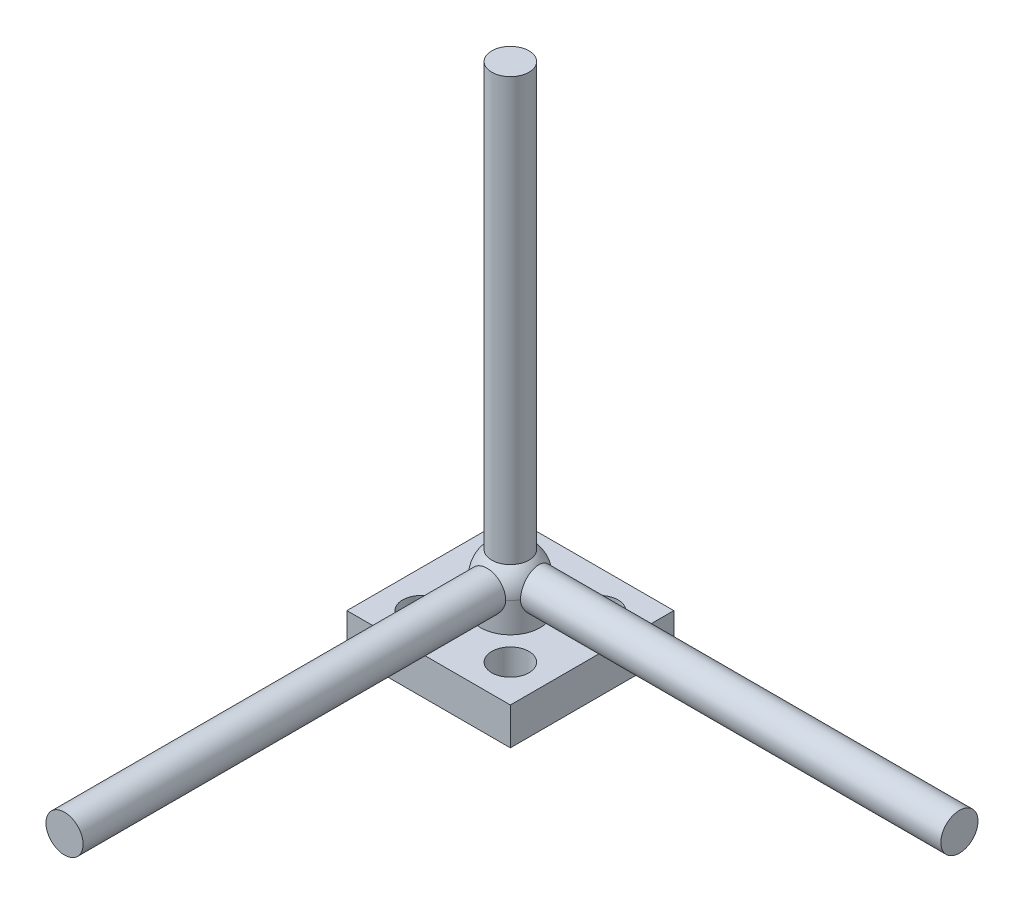
ISO-10303-21;
HEADER;
FILE_DESCRIPTION(('STEP AP214'),'2;1');
FILE_NAME('part.step','',(''),(''),'','','');
FILE_SCHEMA(('AUTOMOTIVE_DESIGN { 1 0 10303 214 1 1 1 1 }'));
ENDSEC;
DATA;
#1=APPLICATION_CONTEXT('core data for automotive mechanical design processes');
#2=APPLICATION_PROTOCOL_DEFINITION('international standard','automotive_design',2000,#1);
#3=PRODUCT_CONTEXT('',#1,'mechanical');
#4=PRODUCT('Part','Part','',(#3));
#5=PRODUCT_RELATED_PRODUCT_CATEGORY('part','',(#4));
#6=PRODUCT_DEFINITION_FORMATION('','',#4);
#7=PRODUCT_DEFINITION_CONTEXT('part definition',#1,'design');
#8=PRODUCT_DEFINITION('design','',#6,#7);
#9=PRODUCT_DEFINITION_SHAPE('','',#8);
#10=(LENGTH_UNIT() NAMED_UNIT(*) SI_UNIT(.MILLI.,.METRE.));
#11=(NAMED_UNIT(*) PLANE_ANGLE_UNIT() SI_UNIT($,.RADIAN.));
#12=(NAMED_UNIT(*) SI_UNIT($,.STERADIAN.) SOLID_ANGLE_UNIT());
#13=UNCERTAINTY_MEASURE_WITH_UNIT(LENGTH_MEASURE(1.E-05),#10,'distance_accuracy_value','');
#14=(GEOMETRIC_REPRESENTATION_CONTEXT(3) GLOBAL_UNCERTAINTY_ASSIGNED_CONTEXT((#13)) GLOBAL_UNIT_ASSIGNED_CONTEXT((#10,
#11,#12)) REPRESENTATION_CONTEXT('',''));
#15=CARTESIAN_POINT('',(0.,0.,0.));
#16=DIRECTION('',(0.,0.,1.));
#17=DIRECTION('',(1.,0.,0.));
#18=AXIS2_PLACEMENT_3D('',#15,#16,#17);
#19=CARTESIAN_POINT('',(0.,9.,0.));
#20=DIRECTION('',(0.,-1.,0.));
#21=DIRECTION('',(0.,0.,-1.));
#22=AXIS2_PLACEMENT_3D('',#19,#20,#21);
#23=CYLINDRICAL_SURFACE('',#22,4.);
#24=CARTESIAN_POINT('',(0.,5.,0.));
#25=DIRECTION('',(0.,-1.,0.));
#26=DIRECTION('',(0.,0.,-1.));
#27=AXIS2_PLACEMENT_3D('',#24,#25,#26);
#28=CIRCLE('',#27,4.);
#29=CARTESIAN_POINT('',(0.,5.,-4.));
#30=VERTEX_POINT('',#29);
#31=EDGE_CURVE('E108',#30,#30,#28,.T.);
#32=ORIENTED_EDGE('',*,*,#31,.F.);
#33=EDGE_LOOP('',(#32));
#34=FACE_BOUND('',#33,.T.);
#35=CARTESIAN_POINT('',(0.,9.,0.));
#36=DIRECTION('',(0.,-1.,0.));
#37=DIRECTION('',(0.,0.,-1.));
#38=AXIS2_PLACEMENT_3D('',#35,#36,#37);
#39=CIRCLE('',#38,4.);
#40=CARTESIAN_POINT('',(-2.5,9.,3.1224989991992));
#41=VERTEX_POINT('',#40);
#42=CARTESIAN_POINT('',(2.713622209593,9.,-2.9387505004004));
#43=VERTEX_POINT('',#42);
#44=EDGE_CURVE('E100',#41,#43,#39,.T.);
#45=ORIENTED_EDGE('',*,*,#44,.T.);
#46=CARTESIAN_POINT('',(3.42800969957793,9.,2.0612494995996));
#47=CARTESIAN_POINT('',(3.42802038790868,9.13026135972633,2.0612419052499));
#48=CARTESIAN_POINT('',(3.43424101726913,9.26074277237895,2.05099325827633));
#49=CARTESIAN_POINT('',(3.4580690540885,9.51767210537658,2.01054114311706));
#50=CARTESIAN_POINT('',(3.47570727586293,9.64410813592399,1.98028366942228));
#51=CARTESIAN_POINT('',(3.51942581384705,9.88865756454744,1.9014831189024));
#52=CARTESIAN_POINT('',(3.54545409925808,10.0068169301907,1.85305244661234));
#53=CARTESIAN_POINT('',(3.60252255102449,10.2334121318975,1.73949954429685));
#54=CARTESIAN_POINT('',(3.63356262760076,10.341848142087,1.67437761325933));
#55=CARTESIAN_POINT('',(3.7000822413658,10.5568638804176,1.52213679037703));
#56=CARTESIAN_POINT('',(3.7357077613753,10.6623597747365,1.43354755523072));
#57=CARTESIAN_POINT('',(3.80442537038909,10.857867335649,1.23972616144308));
#58=CARTESIAN_POINT('',(3.8375162620606,10.9478717089369,1.13448620825776));
#59=CARTESIAN_POINT('',(3.89836345764576,11.1136504181868,0.904187484131161));
#60=CARTESIAN_POINT('',(3.92581437911848,11.1886066647498,0.778452078282578));
#61=CARTESIAN_POINT('',(3.96906285977782,11.3158906334044,0.51418613997217));
#62=CARTESIAN_POINT('',(3.98487380149797,11.368244313019,0.375670507914283));
#63=CARTESIAN_POINT('',(4.00059864656233,11.4433662779335,0.106485647628052));
#64=CARTESIAN_POINT('',(4.00207678680657,11.4687654704651,-0.0233580679752801));
#65=CARTESIAN_POINT('',(3.99198197601377,11.4987253721379,-0.28490242778374));
#66=CARTESIAN_POINT('',(3.98041548664065,11.5032963928738,-0.416602120730132));
#67=CARTESIAN_POINT('',(3.94602158489037,11.4925134538478,-0.665858084556408));
#68=CARTESIAN_POINT('',(3.92426603966481,11.4788650251918,-0.783644929784783));
#69=CARTESIAN_POINT('',(3.87114490652014,11.4357371177857,-1.01401137328338));
#70=CARTESIAN_POINT('',(3.83977698364927,11.4062537912545,-1.12658969869116));
#71=CARTESIAN_POINT('',(3.76712452162126,11.3310373645404,-1.35032176175276));
#72=CARTESIAN_POINT('',(3.72538830525859,11.2844973970169,-1.46105413343702));
#73=CARTESIAN_POINT('',(3.63532879753264,11.1775349964946,-1.67260885737574));
#74=CARTESIAN_POINT('',(3.58700449027072,11.1171104214707,-1.77342967711149));
#75=CARTESIAN_POINT('',(3.47802529720666,10.9732887266442,-1.97965637058244));
#76=CARTESIAN_POINT('',(3.41663820821204,10.8877588528214,-2.08318356561219));
#77=CARTESIAN_POINT('',(3.29198691872054,10.7017232736575,-2.27506710612456));
#78=CARTESIAN_POINT('',(3.2287183331008,10.6011799578739,-2.36338411626043));
#79=CARTESIAN_POINT('',(3.13136142504637,10.4318040890128,-2.48957441367807));
#80=CARTESIAN_POINT('',(3.09627403897767,10.3675996854581,-2.53295936516354));
#81=CARTESIAN_POINT('',(3.02816693266716,10.2346490870281,-2.61400311710698));
#82=CARTESIAN_POINT('',(2.99514797315186,10.1659012400453,-2.65165981801561));
#83=CARTESIAN_POINT('',(2.90130959507655,9.95333768340782,-2.75517600604384));
#84=CARTESIAN_POINT('',(2.8452970661671,9.80253169999326,-2.81208906235644));
#85=CARTESIAN_POINT('',(2.77680711182225,9.55039215221369,-2.87935086313321));
#86=CARTESIAN_POINT('',(2.75588771642747,9.45384598370284,-2.89922346709129));
#87=CARTESIAN_POINT('',(2.72589741528889,9.25732920817719,-2.92744210874999));
#88=CARTESIAN_POINT('',(2.71680566742093,9.15736494436734,-2.93580842378396));
#89=CARTESIAN_POINT('',(2.71184309823816,8.95651704710889,-2.94039550585132));
#90=CARTESIAN_POINT('',(2.71601199139763,8.85563155595563,-2.93657978862433));
#91=CARTESIAN_POINT('',(2.73697599362659,8.65631812513817,-2.91704489979416));
#92=CARTESIAN_POINT('',(2.7537869554558,8.55789343148299,-2.90131078270888));
#93=CARTESIAN_POINT('',(2.80312228231286,8.34213714314039,-2.85375725400191));
#94=CARTESIAN_POINT('',(2.83850209678923,8.22613976988872,-2.81892485577166));
#95=CARTESIAN_POINT('',(2.91977000189019,8.00348115766155,-2.73465978790455));
#96=CARTESIAN_POINT('',(2.96568244534391,7.89684235950608,-2.68519320412048));
#97=CARTESIAN_POINT('',(3.07909317567708,7.66041539712968,-2.55515522612552));
#98=CARTESIAN_POINT('',(3.14875908770808,7.5343577449252,-2.46969945895492));
#99=CARTESIAN_POINT('',(3.28999075249712,7.30019513405739,-2.27819487248764));
#100=CARTESIAN_POINT('',(3.36155812075098,7.19210604669105,-2.17212802525631));
#101=CARTESIAN_POINT('',(3.50097462640551,6.99471976963405,-1.93951956651389));
#102=CARTESIAN_POINT('',(3.56878511611489,6.90559791883449,-1.81280455361485));
#103=CARTESIAN_POINT('',(3.69412058260828,6.75086671227162,-1.54132742161601));
#104=CARTESIAN_POINT('',(3.7516680978397,6.68520550814971,-1.39660606392742));
#105=CARTESIAN_POINT('',(3.83875525693991,6.59463588516444,-1.13065461236131));
#106=CARTESIAN_POINT('',(3.87170005644639,6.56364214790089,-1.01260263912067));
#107=CARTESIAN_POINT('',(3.92697510889789,6.51911566056514,-0.770839461827849));
#108=CARTESIAN_POINT('',(3.94931275941032,6.5055707301363,-0.647132268004803));
#109=CARTESIAN_POINT('',(3.98224284734054,6.49721003754877,-0.397102286214895));
#110=CARTESIAN_POINT('',(3.99279744860349,6.50245438341272,-0.270772391620868));
#111=CARTESIAN_POINT('',(4.00191892288327,6.53209780604427,-0.0199338914331121));
#112=CARTESIAN_POINT('',(4.00048483222205,6.55649842249322,0.104574566943625));
#113=CARTESIAN_POINT('',(3.98705687256448,6.62193490672071,0.341757051872466));
#114=CARTESIAN_POINT('',(3.97559473092911,6.66207773732151,0.454711520020314));
#115=CARTESIAN_POINT('',(3.94455387641592,6.7575304517224,0.672783953464242));
#116=CARTESIAN_POINT('',(3.92497375845407,6.81284296057523,0.77790055844127));
#117=CARTESIAN_POINT('',(3.87826953627958,6.94146393965841,0.985462132521067));
#118=CARTESIAN_POINT('',(3.85070831331247,7.01577171665501,1.08718678680657));
#119=CARTESIAN_POINT('',(3.79173402639399,7.17812886368742,1.27778152400989));
#120=CARTESIAN_POINT('',(3.76031804696707,7.26618864870714,1.36664176505343));
#121=CARTESIAN_POINT('',(3.69286411378198,7.46603155314002,1.54027954740605));
#122=CARTESIAN_POINT('',(3.65673388546829,7.57940099722978,1.62320274938583));
#123=CARTESIAN_POINT('',(3.58830195715208,7.81933224316565,1.76935611394857));
#124=CARTESIAN_POINT('',(3.55600044433693,7.94589468945464,1.83258531392998));
#125=CARTESIAN_POINT('',(3.50355791683194,8.19320458291638,1.93074924996928));
#126=CARTESIAN_POINT('',(3.48240628309289,8.31273084647667,1.96821841980923));
#127=CARTESIAN_POINT('',(3.44977553779703,8.55711988693192,2.02488250550271));
#128=CARTESIAN_POINT('',(3.43826718878294,8.68196531812763,2.04413268263688));
#129=CARTESIAN_POINT('',(3.43097686933111,8.83960883814733,2.05630686709162));
#130=CARTESIAN_POINT('',(3.42986687264863,8.87164343700879,2.05815837321686));
#131=CARTESIAN_POINT('',(3.42838191933379,8.93578089250081,2.06063071076387));
#132=CARTESIAN_POINT('',(3.42800706434506,8.96788375795598,2.06125137200423));
#133=CARTESIAN_POINT('',(3.42800969957793,9.,2.0612494995996));
#134=B_SPLINE_CURVE_WITH_KNOTS('',3,(#46,#47,#48,#49,#50,#51,#52,#53,#54,#55,#56,#57,#58,#59,
#60,#61,#62,#63,#64,#65,#66,#67,#68,#69,#70,#71,#72,#73,#74,#75,#76,#77,#78,#79,#80,#81,#82,#83,
#84,#85,#86,#87,#88,#89,#90,#91,#92,#93,#94,#95,#96,#97,#98,#99,#100,#101,#102,#103,#104,#105,
#106,#107,#108,#109,#110,#111,#112,#113,#114,#115,#116,#117,#118,#119,#120,#121,#122,#123,#124,
#125,#126,#127,#128,#129,#130,#131,#132,#133),.UNSPECIFIED.,.T.,.F.,(4,2,2,2,2,2,2,2,2,2,2,2,2,
2,2,2,2,2,2,2,2,2,2,2,2,2,2,2,2,2,2,2,2,2,2,2,2,2,2,2,2,2,2,4),(0.,0.390644734568745,
0.782348179397376,1.1716677667048,1.56098038067869,1.98602493123325,2.41126904582912,
2.85556297804354,3.2993453025184,3.69406571573385,4.08859068983681,4.44865471087384,
4.80880626482753,5.18883033356501,5.5689130693029,6.01023676454574,6.45268517443062,
6.70755001956426,6.96250805521576,7.46965360894023,7.770794274851,8.07140356281741,
8.37291399635924,8.67480314634302,9.05125316425244,9.42858251699354,9.92846485886231,
10.4287864180337,10.933549468738,11.4371899835843,11.8148600840363,12.1922664040614,
12.5708811460743,12.9495263222856,13.3092338193403,13.6690036016712,14.0543320784845,
14.4399538090646,14.8731228471001,15.3063130542089,15.685851765993,16.0642355481101,
16.1605366044726,16.256850974866),.UNSPECIFIED.);
#135=CARTESIAN_POINT('',(3.42800969957793,9.,2.0612494995996));
#136=VERTEX_POINT('',#135);
#137=EDGE_CURVE('E59',#43,#136,#134,.T.);
#138=ORIENTED_EDGE('',*,*,#137,.T.);
#139=CARTESIAN_POINT('',(2.5,9.,3.1224989991992));
#140=VERTEX_POINT('',#139);
#141=EDGE_CURVE('E65',#136,#140,#39,.T.);
#142=ORIENTED_EDGE('',*,*,#141,.T.);
#143=CARTESIAN_POINT('',(-2.5,9.,3.1224989991992));
#144=CARTESIAN_POINT('',(-2.49999941097139,9.06215675144551,3.12249991555421));
#145=CARTESIAN_POINT('',(-2.49767581942173,9.12432594667079,3.12436490733917));
#146=CARTESIAN_POINT('',(-2.48843349840857,9.24811717954774,3.13172923119026));
#147=CARTESIAN_POINT('',(-2.48151206248433,9.30973887325711,3.13723070381364));
#148=CARTESIAN_POINT('',(-2.45397595058365,9.49322604774371,3.15888953558505));
#149=CARTESIAN_POINT('',(-2.42658990946459,9.61354833118898,3.18020036271142));
#150=CARTESIAN_POINT('',(-2.35576217141198,9.84559819787824,3.23299770760367));
#151=CARTESIAN_POINT('',(-2.31245961359202,9.95739041505511,3.26439575383209));
#152=CARTESIAN_POINT('',(-2.21143916430899,10.1720085253341,3.3336600088444));
#153=CARTESIAN_POINT('',(-2.15372087963017,10.2748341737531,3.37152639405534));
#154=CARTESIAN_POINT('',(-2.01647682425578,10.4837339813037,3.45559225121876));
#155=CARTESIAN_POINT('',(-1.93506425666949,10.5883933250045,3.50222814511578));
#156=CARTESIAN_POINT('',(-1.75662526657432,10.7837615516238,3.59505503533367));
#157=CARTESIAN_POINT('',(-1.65958538899782,10.8744582799536,3.64124561158438));
#158=CARTESIAN_POINT('',(-1.43833990582854,11.0502202981727,3.73459524771314));
#159=CARTESIAN_POINT('',(-1.31226934259652,11.1332861844504,3.78119887781505));
#160=CARTESIAN_POINT('',(-1.11163395543429,11.2405451547362,3.84307251838774));
#161=CARTESIAN_POINT('',(-1.04281240974104,11.2734151383331,3.86236283092052));
#162=CARTESIAN_POINT('',(-0.901758767615551,11.3329546853633,3.89770436975436));
#163=CARTESIAN_POINT('',(-0.829529068393798,11.3596285310384,3.91375783207118));
#164=CARTESIAN_POINT('',(-0.689700297916578,11.4039838152563,3.94066759113823));
#165=CARTESIAN_POINT('',(-0.62237198127859,11.4223019765181,3.95188535984466));
#166=CARTESIAN_POINT('',(-0.48599757589881,11.4533022863134,3.97096241909162));
#167=CARTESIAN_POINT('',(-0.416952503441684,11.4659876892162,3.97882364879721));
#168=CARTESIAN_POINT('',(-0.277765449857175,11.4855137976345,3.99095470334737));
#169=CARTESIAN_POINT('',(-0.207624174243907,11.4923581165134,3.99522674847834));
#170=CARTESIAN_POINT('',(-0.06691144665994,11.5000992133892,4.00006125072438));
#171=CARTESIAN_POINT('',(0.00365995486027784,11.5009966759634,4.00062413482248));
#172=CARTESIAN_POINT('',(0.196045081555537,11.4952746264528,3.99704479619503));
#173=CARTESIAN_POINT('',(0.317681845488535,11.4826934969211,3.98917040897436));
#174=CARTESIAN_POINT('',(0.556636494620254,11.4402697820339,3.96290903275931));
#175=CARTESIAN_POINT('',(0.673954052677425,11.4104258920264,3.94452124920477));
#176=CARTESIAN_POINT('',(0.901771991763866,11.3347914407167,3.89876170711609));
#177=CARTESIAN_POINT('',(1.01225407159606,11.2889600804289,3.87136697381047));
#178=CARTESIAN_POINT('',(1.22404012071223,11.1830627610157,3.80971291751354));
#179=CARTESIAN_POINT('',(1.32534199174245,11.1229935589364,3.77545203089318));
#180=CARTESIAN_POINT('',(1.52942649744659,10.9819435830763,3.69786441247167));
#181=CARTESIAN_POINT('',(1.63082454612907,10.8992907233095,3.65394006381521));
#182=CARTESIAN_POINT('',(1.81919733573063,10.7197352627929,3.56390927740507));
#183=CARTESIAN_POINT('',(1.90615071842624,10.622811953616,3.51779973570409));
#184=CARTESIAN_POINT('',(2.07470887167909,10.4025887468265,3.42142883464466));
#185=CARTESIAN_POINT('',(2.15413229677844,10.2774972366419,3.37141162686597));
#186=CARTESIAN_POINT('',(2.29052307550563,10.0127077626986,3.28028278192382));
#187=CARTESIAN_POINT('',(2.34753179448504,9.8730373125469,3.23915480386931));
#188=CARTESIAN_POINT('',(2.42437133527931,9.62046119389376,3.18183753131763));
#189=CARTESIAN_POINT('',(2.45003683445404,9.51017807478652,3.16193408602513));
#190=CARTESIAN_POINT('',(2.48620337073091,9.28576962244012,3.13358277759547));
#191=CARTESIAN_POINT('',(2.49672512520811,9.1716497573432,3.12511926504439));
#192=CARTESIAN_POINT('',(2.5019707209518,8.94254263949756,3.12092267030677));
#193=CARTESIAN_POINT('',(2.49665835896695,8.82755399952155,3.12521876170185));
#194=CARTESIAN_POINT('',(2.47051466367814,8.60043883568153,3.14592085836188));
#195=CARTESIAN_POINT('',(2.44967047849126,8.48831476162883,3.16233689222906));
#196=CARTESIAN_POINT('',(2.39409874195038,8.27156324057431,3.20460120797143));
#197=CARTESIAN_POINT('',(2.35960571424758,8.16684268410568,3.23028954367817));
#198=CARTESIAN_POINT('',(2.27804893702243,7.96442530010622,3.28831148388749));
#199=CARTESIAN_POINT('',(2.23098072583747,7.86673098112204,3.32064744602081));
#200=CARTESIAN_POINT('',(2.11530798730694,7.66138805833681,3.39574401285203));
#201=CARTESIAN_POINT('',(2.04430931160544,7.55538547269824,3.43931724293015));
#202=CARTESIAN_POINT('',(1.8873786892149,7.35562933934574,3.52787943213338));
#203=CARTESIAN_POINT('',(1.8014312490262,7.26188867875767,3.57286982004467));
#204=CARTESIAN_POINT('',(1.60076932492121,7.07403592935904,3.66766209459504));
#205=CARTESIAN_POINT('',(1.48365201617177,6.9822726015151,3.71707933883201));
#206=CARTESIAN_POINT('',(1.2325678740781,6.81985298528028,3.80768973398606));
#207=CARTESIAN_POINT('',(1.09860897940974,6.74918680487308,3.84888673619009));
#208=CARTESIAN_POINT('',(0.891930804655086,6.66341893202502,3.89988966499776));
#209=CARTESIAN_POINT('',(0.824318196039424,6.63870255604872,3.91477055097245));
#210=CARTESIAN_POINT('',(0.686640792876427,6.59506172326773,3.94124643918618));
#211=CARTESIAN_POINT('',(0.616577444051139,6.57613391384908,3.95284334314805));
#212=CARTESIAN_POINT('',(0.474639231464267,6.54439416986075,3.9723851203995));
#213=CARTESIAN_POINT('',(0.402766005755511,6.53157690048358,3.98033317908836));
#214=CARTESIAN_POINT('',(0.257881807142465,6.51226082770711,3.99234168343343));
#215=CARTESIAN_POINT('',(0.184871024482539,6.50576097906921,3.99640277220024));
#216=CARTESIAN_POINT('',(-0.0131102774248886,6.49692848449289,4.00191521492706));
#217=CARTESIAN_POINT('',(-0.138539079205446,6.50073420709059,3.99952706123947));
#218=CARTESIAN_POINT('',(-0.386583137102128,6.52691758954553,3.98321975018363));
#219=CARTESIAN_POINT('',(-0.509198520626827,6.54929440667881,3.96930111604857));
#220=CARTESIAN_POINT('',(-0.744080605483846,6.61032241554611,3.93192083384285));
#221=CARTESIAN_POINT('',(-0.856558752631808,6.64838207356467,3.90880701054803));
#222=CARTESIAN_POINT('',(-1.07343034721917,6.73911946244348,3.85489971248843));
#223=CARTESIAN_POINT('',(-1.17782242685802,6.7917996595672,3.82410494215309));
#224=CARTESIAN_POINT('',(-1.38731297754797,6.91632127871995,3.75350673935649));
#225=CARTESIAN_POINT('',(-1.49136012183779,6.98958399075749,3.71310001864657));
#226=CARTESIAN_POINT('',(-1.68643334934802,7.1501532325141,3.62867283985206));
#227=CARTESIAN_POINT('',(-1.7774445184368,7.23747560883428,3.58464833191203));
#228=CARTESIAN_POINT('',(-1.95744716561589,7.43823251506187,3.49000828219719));
#229=CARTESIAN_POINT('',(-2.04425661250063,7.55361661257142,3.43935738427104));
#230=CARTESIAN_POINT('',(-2.19754648509904,7.79928940975975,3.34349647457112));
#231=CARTESIAN_POINT('',(-2.26403815415027,7.92956981115252,3.2982834620419));
#232=CARTESIAN_POINT('',(-2.3619822941284,8.17280530078491,3.22859539780091));
#233=CARTESIAN_POINT('',(-2.39792458576829,8.28327057215355,3.20174639338769));
#234=CARTESIAN_POINT('',(-2.45425618419746,8.50993934300177,3.1587835810451));
#235=CARTESIAN_POINT('',(-2.47469472410168,8.62612341979971,3.14263581150428));
#236=CARTESIAN_POINT('',(-2.49119847139522,8.78605999464607,3.12952857640607));
#237=CARTESIAN_POINT('',(-2.4944943383796,8.82872552570865,3.1268999430677));
#238=CARTESIAN_POINT('',(-2.49889558125807,8.91425869895175,3.12338461939862));
#239=CARTESIAN_POINT('',(-2.50000040629188,8.95712638924335,3.12249836712871));
#240=CARTESIAN_POINT('',(-2.5,9.,3.1224989991992));
#241=B_SPLINE_CURVE_WITH_KNOTS('',3,(#143,#144,#145,#146,#147,#148,#149,#150,#151,#152,#153,
#154,#155,#156,#157,#158,#159,#160,#161,#162,#163,#164,#165,#166,#167,#168,#169,#170,#171,#172,
#173,#174,#175,#176,#177,#178,#179,#180,#181,#182,#183,#184,#185,#186,#187,#188,#189,#190,#191,
#192,#193,#194,#195,#196,#197,#198,#199,#200,#201,#202,#203,#204,#205,#206,#207,#208,#209,#210,
#211,#212,#213,#214,#215,#216,#217,#218,#219,#220,#221,#222,#223,#224,#225,#226,#227,#228,#229,
#230,#231,#232,#233,#234,#235,#236,#237,#238,#239,#240),.UNSPECIFIED.,.T.,.F.,(4,2,2,2,2,2,2,2,
2,2,2,2,2,2,2,2,2,2,2,2,2,2,2,2,2,2,2,2,2,2,2,2,2,2,2,2,2,2,2,2,2,2,2,2,2,2,2,2,4),(0.,
0.186415315858461,0.372940459994498,0.746478880764687,1.11682668423133,1.48718459072605,
1.9072279868507,2.32763499192879,2.7987602926597,3.03445880867314,3.26999394209509,
3.48170145743205,3.69328649746504,3.90474055342595,4.11617026725867,4.48184709708114,
4.84755156693919,5.21419620193004,5.58092442797435,5.99329080205307,6.40626158573465,
6.87316206383505,7.33919680735486,7.68265621505466,8.02564530559509,8.36941921026407,
8.7134778886509,9.05186495232125,9.390372235192,9.79332737765187,10.1967026751544,
10.6647326786671,11.1325428866818,11.3527929661039,11.5729152387446,11.7928449800804,
12.0127383271002,12.3871595324234,12.7615637480926,13.1229788842094,13.4844550226785,
13.8834503840958,14.2828986410983,14.7399238503459,15.1966956936287,15.5530255473292,
15.9082190611886,16.0367696833384,16.1653526209168),.UNSPECIFIED.);
#242=EDGE_CURVE('E110',#140,#41,#241,.T.);
#243=ORIENTED_EDGE('',*,*,#242,.T.);
#244=EDGE_LOOP('',(#45,#138,#142,#243));
#245=FACE_BOUND('',#244,.T.);
#246=ADVANCED_FACE('F39',(#34,#245),#23,.T.);
#247=CARTESIAN_POINT('',(0.,9.,0.));
#248=DIRECTION('',(0.,-1.,0.));
#249=DIRECTION('',(-1.,0.,0.));
#250=AXIS2_PLACEMENT_3D('',#247,#248,#249);
#251=SPHERICAL_SURFACE('',#250,4.);
#252=CARTESIAN_POINT('',(0.,12.1224989991992,0.));
#253=DIRECTION('',(0.,-1.,0.));
#254=DIRECTION('',(0.,0.,-1.));
#255=AXIS2_PLACEMENT_3D('',#252,#253,#254);
#256=CIRCLE('',#255,2.5);
#257=CARTESIAN_POINT('',(0.,12.1224989991992,-2.5));
#258=VERTEX_POINT('',#257);
#259=EDGE_CURVE('E170',#258,#258,#256,.F.);
#260=ORIENTED_EDGE('',*,*,#259,.F.);
#261=EDGE_LOOP('',(#260));
#262=FACE_BOUND('',#261,.T.);
#263=ORIENTED_EDGE('',*,*,#141,.F.);
#264=CARTESIAN_POINT('',(3.42800969855401,8.9998,2.0612494915996));
#265=CARTESIAN_POINT('',(3.42801105659738,9.06968977291703,2.06126211810812));
#266=CARTESIAN_POINT('',(3.42763602252409,9.13957643204028,2.05832996720951));
#267=CARTESIAN_POINT('',(3.42613824632382,9.27884729310849,2.04663043047118));
#268=CARTESIAN_POINT('',(3.42501555107409,9.34823152627915,2.03786341046923));
#269=CARTESIAN_POINT('',(3.42202889756569,9.48594702311417,2.01455913295229));
#270=CARTESIAN_POINT('',(3.42016561996449,9.55427919397628,2.00002717392435));
#271=CARTESIAN_POINT('',(3.41570983518744,9.68944914036821,1.96531601337523));
#272=CARTESIAN_POINT('',(3.4131173348385,9.75628692988195,1.94513686472244));
#273=CARTESIAN_POINT('',(3.40426165017361,9.95390337935224,1.87630542475153));
#274=CARTESIAN_POINT('',(3.39691879573171,10.0818536251463,1.81934747236231));
#275=CARTESIAN_POINT('',(3.37952825999966,10.3262483671708,1.68505120466585));
#276=CARTESIAN_POINT('',(3.36948095762743,10.4426944721148,1.60771574446604));
#277=CARTESIAN_POINT('',(3.34686302500727,10.6613423452391,1.43459901201905));
#278=CARTESIAN_POINT('',(3.33428402437302,10.7634949045628,1.33875659525956));
#279=CARTESIAN_POINT('',(3.30690648367733,10.9502828032587,1.13155589034326));
#280=CARTESIAN_POINT('',(3.29210754585587,11.0349149969166,1.02019482186718));
#281=CARTESIAN_POINT('',(3.26050851355046,11.1849516943337,0.784230018771541));
#282=CARTESIAN_POINT('',(3.24369391368131,11.2502034290812,0.659531087845209));
#283=CARTESIAN_POINT('',(3.20855555817001,11.3588540562986,0.401160135150561));
#284=CARTESIAN_POINT('',(3.19023182863887,11.4022533267681,0.267488268639628));
#285=CARTESIAN_POINT('',(3.15236275398107,11.4663442812376,-0.00623613683675467));
#286=CARTESIAN_POINT('',(3.13280842835187,11.486841855142,-0.146332895196099));
#287=CARTESIAN_POINT('',(3.09312331247774,11.5039525887953,-0.427901195680022));
#288=CARTESIAN_POINT('',(3.07299248582712,11.5005642368359,-0.569372824252455));
#289=CARTESIAN_POINT('',(3.03258316631055,11.4699274417858,-0.850542350683427));
#290=CARTESIAN_POINT('',(3.01230449671276,11.4425400266254,-0.990225101683572));
#291=CARTESIAN_POINT('',(2.97230720322695,11.3644712812261,-1.26300926216284));
#292=CARTESIAN_POINT('',(2.9525885852687,11.3137897044491,-1.39611060196988));
#293=CARTESIAN_POINT('',(2.91431943747548,11.1904924498008,-1.65197609785168));
#294=CARTESIAN_POINT('',(2.89576929028397,11.1178696314146,-1.77473687205598));
#295=CARTESIAN_POINT('',(2.8604678460916,10.9526869057791,-2.00630842459227));
#296=CARTESIAN_POINT('',(2.84371641473279,10.8601284892057,-2.11512024498141));
#297=CARTESIAN_POINT('',(2.81272150109155,10.6583245627167,-2.31491351363223));
#298=CARTESIAN_POINT('',(2.79846202327347,10.5491945737086,-2.40600914109997));
#299=CARTESIAN_POINT('',(2.77285912838204,10.3168107893585,-2.56856560270325));
#300=CARTESIAN_POINT('',(2.76151647007925,10.1935533309804,-2.64002132811989));
#301=CARTESIAN_POINT('',(2.74232125875502,9.93788966160392,-2.76041596573079));
#302=CARTESIAN_POINT('',(2.73443266029983,9.80559545374435,-2.80958762639635));
#303=CARTESIAN_POINT('',(2.72231241786162,9.53457963459118,-2.8849592439374));
#304=CARTESIAN_POINT('',(2.71807480229123,9.39586891136424,-2.91119671325286));
#305=CARTESIAN_POINT('',(2.71503855484026,9.21349549158291,-2.92998842034368));
#306=CARTESIAN_POINT('',(2.71450676120406,9.17078763843843,-2.93327879443847));
#307=CARTESIAN_POINT('',(2.71379880497258,9.08532565989503,-2.93765849844552));
#308=CARTESIAN_POINT('',(2.71362206708448,9.04257172183516,-2.93875138891818));
#309=CARTESIAN_POINT('',(2.71362221088647,8.9998,-2.9387504924004));
#310=B_SPLINE_CURVE_WITH_KNOTS('',3,(#264,#265,#266,#267,#268,#269,#270,#271,#272,#273,#274,
#275,#276,#277,#278,#279,#280,#281,#282,#283,#284,#285,#286,#287,#288,#289,#290,#291,#292,#293,
#294,#295,#296,#297,#298,#299,#300,#301,#302,#303,#304,#305,#306,#307,#308,#309),.UNSPECIFIED.,
.F.,.F.,(4,2,2,2,2,2,2,2,2,2,2,2,2,2,2,2,2,2,2,2,2,2,4),(0.,0.209600587664554,0.419188034915742,
0.628583297462054,0.837976599737239,1.25655730967808,1.67507940312815,2.09500865700478,
2.51501324229927,2.93824568360856,3.36147080367603,3.78825650643106,4.21506922012787,
4.6443699456366,5.07367521483287,5.50312034706801,5.93253337886872,6.35907982564409,
6.78573712063182,7.20782919199923,7.62922956718325,7.75770291764137,7.88596793574468),.UNSPECIFIED.);
#311=EDGE_CURVE('E11',#136,#43,#310,.T.);
#312=ORIENTED_EDGE('',*,*,#311,.T.);
#313=ORIENTED_EDGE('',*,*,#44,.F.);
#314=CARTESIAN_POINT('',(0.,9.,3.1224989991992));
#315=DIRECTION('',(0.,0.,-1.));
#316=DIRECTION('',(-1.,0.,0.));
#317=AXIS2_PLACEMENT_3D('',#314,#315,#316);
#318=CIRCLE('',#317,2.5);
#319=EDGE_CURVE('E53',#41,#140,#318,.T.);
#320=ORIENTED_EDGE('',*,*,#319,.T.);
#321=EDGE_LOOP('',(#263,#312,#313,#320));
#322=FACE_BOUND('',#321,.T.);
#323=ADVANCED_FACE('F105',(#262,#322),#251,.T.);
#324=CARTESIAN_POINT('',(0.,5.,0.));
#325=DIRECTION('',(0.,-1.,0.));
#326=DIRECTION('',(0.,0.,-1.));
#327=AXIS2_PLACEMENT_3D('',#324,#325,#326);
#328=PLANE('',#327);
#329=ORIENTED_EDGE('',*,*,#31,.T.);
#330=EDGE_LOOP('',(#329));
#331=FACE_BOUND('',#330,.T.);
#332=DIRECTION('',(0.,0.,-1.));
#333=VECTOR('',#332,1.);
#334=CARTESIAN_POINT('',(11.,5.,11.));
#335=LINE('',#334,#333);
#336=CARTESIAN_POINT('',(11.,5.,11.));
#337=VERTEX_POINT('',#336);
#338=CARTESIAN_POINT('',(11.,5.,-11.));
#339=VERTEX_POINT('',#338);
#340=EDGE_CURVE('E141',#337,#339,#335,.T.);
#341=ORIENTED_EDGE('',*,*,#340,.T.);
#342=DIRECTION('',(-1.,0.,0.));
#343=VECTOR('',#342,1.);
#344=CARTESIAN_POINT('',(-11.,5.,-11.));
#345=LINE('',#344,#343);
#346=CARTESIAN_POINT('',(-11.,5.,-11.));
#347=VERTEX_POINT('',#346);
#348=EDGE_CURVE('E144',#339,#347,#345,.T.);
#349=ORIENTED_EDGE('',*,*,#348,.T.);
#350=DIRECTION('',(0.,0.,1.));
#351=VECTOR('',#350,1.);
#352=CARTESIAN_POINT('',(-11.,5.,11.));
#353=LINE('',#352,#351);
#354=CARTESIAN_POINT('',(-11.,5.,11.));
#355=VERTEX_POINT('',#354);
#356=EDGE_CURVE('E147',#347,#355,#353,.T.);
#357=ORIENTED_EDGE('',*,*,#356,.T.);
#358=DIRECTION('',(1.,0.,0.));
#359=VECTOR('',#358,1.);
#360=CARTESIAN_POINT('',(-11.,5.,11.));
#361=LINE('',#360,#359);
#362=EDGE_CURVE('E149',#355,#337,#361,.T.);
#363=ORIENTED_EDGE('',*,*,#362,.T.);
#364=EDGE_LOOP('',(#341,#349,#357,#363));
#365=FACE_BOUND('',#364,.T.);
#366=CARTESIAN_POINT('',(-6.,5.,-6.));
#367=DIRECTION('',(0.,1.,0.));
#368=DIRECTION('',(0.,0.,1.));
#369=AXIS2_PLACEMENT_3D('',#366,#367,#368);
#370=CIRCLE('',#369,2.5);
#371=CARTESIAN_POINT('',(-6.,5.,-3.5));
#372=VERTEX_POINT('',#371);
#373=EDGE_CURVE('E135',#372,#372,#370,.T.);
#374=ORIENTED_EDGE('',*,*,#373,.F.);
#375=EDGE_LOOP('',(#374));
#376=FACE_BOUND('',#375,.T.);
#377=CARTESIAN_POINT('',(6.,5.,-6.));
#378=DIRECTION('',(0.,1.,0.));
#379=DIRECTION('',(0.,0.,1.));
#380=AXIS2_PLACEMENT_3D('',#377,#378,#379);
#381=CIRCLE('',#380,2.5);
#382=CARTESIAN_POINT('',(6.,5.,-3.5));
#383=VERTEX_POINT('',#382);
#384=EDGE_CURVE('E129',#383,#383,#381,.T.);
#385=ORIENTED_EDGE('',*,*,#384,.F.);
#386=EDGE_LOOP('',(#385));
#387=FACE_BOUND('',#386,.T.);
#388=CARTESIAN_POINT('',(-6.,5.,6.));
#389=DIRECTION('',(0.,1.,0.));
#390=DIRECTION('',(0.,0.,1.));
#391=AXIS2_PLACEMENT_3D('',#388,#389,#390);
#392=CIRCLE('',#391,2.5);
#393=CARTESIAN_POINT('',(-6.,5.,8.5));
#394=VERTEX_POINT('',#393);
#395=EDGE_CURVE('E123',#394,#394,#392,.T.);
#396=ORIENTED_EDGE('',*,*,#395,.F.);
#397=EDGE_LOOP('',(#396));
#398=FACE_BOUND('',#397,.T.);
#399=CARTESIAN_POINT('',(6.,5.,6.));
#400=DIRECTION('',(0.,1.,0.));
#401=DIRECTION('',(0.,0.,1.));
#402=AXIS2_PLACEMENT_3D('',#399,#400,#401);
#403=CIRCLE('',#402,2.5);
#404=CARTESIAN_POINT('',(6.,5.,8.5));
#405=VERTEX_POINT('',#404);
#406=EDGE_CURVE('E117',#405,#405,#403,.T.);
#407=ORIENTED_EDGE('',*,*,#406,.F.);
#408=EDGE_LOOP('',(#407));
#409=FACE_BOUND('',#408,.T.);
#410=ADVANCED_FACE('F178',(#331,#365,#376,#387,#398,#409),#328,.F.);
#411=CARTESIAN_POINT('',(0.,0.,0.));
#412=DIRECTION('',(0.,-1.,0.));
#413=DIRECTION('',(0.,0.,-1.));
#414=AXIS2_PLACEMENT_3D('',#411,#412,#413);
#415=PLANE('',#414);
#416=CARTESIAN_POINT('',(-6.,0.,6.));
#417=DIRECTION('',(0.,1.,0.));
#418=DIRECTION('',(0.,0.,1.));
#419=AXIS2_PLACEMENT_3D('',#416,#417,#418);
#420=CIRCLE('',#419,2.5);
#421=CARTESIAN_POINT('',(-6.,0.,8.5));
#422=VERTEX_POINT('',#421);
#423=EDGE_CURVE('E120',#422,#422,#420,.T.);
#424=ORIENTED_EDGE('',*,*,#423,.T.);
#425=EDGE_LOOP('',(#424));
#426=FACE_BOUND('',#425,.T.);
#427=CARTESIAN_POINT('',(-6.,0.,-6.));
#428=DIRECTION('',(0.,1.,0.));
#429=DIRECTION('',(0.,0.,1.));
#430=AXIS2_PLACEMENT_3D('',#427,#428,#429);
#431=CIRCLE('',#430,2.5);
#432=CARTESIAN_POINT('',(-6.,0.,-3.5));
#433=VERTEX_POINT('',#432);
#434=EDGE_CURVE('E132',#433,#433,#431,.T.);
#435=ORIENTED_EDGE('',*,*,#434,.T.);
#436=EDGE_LOOP('',(#435));
#437=FACE_BOUND('',#436,.T.);
#438=DIRECTION('',(0.,0.,-1.));
#439=VECTOR('',#438,1.);
#440=CARTESIAN_POINT('',(11.,0.,11.));
#441=LINE('',#440,#439);
#442=CARTESIAN_POINT('',(11.,0.,11.));
#443=VERTEX_POINT('',#442);
#444=CARTESIAN_POINT('',(11.,0.,-11.));
#445=VERTEX_POINT('',#444);
#446=EDGE_CURVE('E138',#443,#445,#441,.T.);
#447=ORIENTED_EDGE('',*,*,#446,.F.);
#448=DIRECTION('',(1.,0.,0.));
#449=VECTOR('',#448,1.);
#450=CARTESIAN_POINT('',(-11.,0.,11.));
#451=LINE('',#450,#449);
#452=CARTESIAN_POINT('',(-11.,0.,11.));
#453=VERTEX_POINT('',#452);
#454=EDGE_CURVE('E145',#453,#443,#451,.T.);
#455=ORIENTED_EDGE('',*,*,#454,.F.);
#456=DIRECTION('',(0.,0.,1.));
#457=VECTOR('',#456,1.);
#458=CARTESIAN_POINT('',(-11.,0.,11.));
#459=LINE('',#458,#457);
#460=CARTESIAN_POINT('',(-11.,0.,-11.));
#461=VERTEX_POINT('',#460);
#462=EDGE_CURVE('E156',#461,#453,#459,.T.);
#463=ORIENTED_EDGE('',*,*,#462,.F.);
#464=DIRECTION('',(-1.,0.,0.));
#465=VECTOR('',#464,1.);
#466=CARTESIAN_POINT('',(-11.,0.,-11.));
#467=LINE('',#466,#465);
#468=EDGE_CURVE('E154',#445,#461,#467,.T.);
#469=ORIENTED_EDGE('',*,*,#468,.F.);
#470=EDGE_LOOP('',(#447,#455,#463,#469));
#471=FACE_BOUND('',#470,.T.);
#472=CARTESIAN_POINT('',(6.,0.,-6.));
#473=DIRECTION('',(0.,1.,0.));
#474=DIRECTION('',(0.,0.,1.));
#475=AXIS2_PLACEMENT_3D('',#472,#473,#474);
#476=CIRCLE('',#475,2.5);
#477=CARTESIAN_POINT('',(6.,0.,-3.5));
#478=VERTEX_POINT('',#477);
#479=EDGE_CURVE('E126',#478,#478,#476,.T.);
#480=ORIENTED_EDGE('',*,*,#479,.T.);
#481=EDGE_LOOP('',(#480));
#482=FACE_BOUND('',#481,.T.);
#483=CARTESIAN_POINT('',(6.,0.,6.));
#484=DIRECTION('',(0.,1.,0.));
#485=DIRECTION('',(0.,0.,1.));
#486=AXIS2_PLACEMENT_3D('',#483,#484,#485);
#487=CIRCLE('',#486,2.5);
#488=CARTESIAN_POINT('',(6.,0.,8.5));
#489=VERTEX_POINT('',#488);
#490=EDGE_CURVE('E116',#489,#489,#487,.T.);
#491=ORIENTED_EDGE('',*,*,#490,.T.);
#492=EDGE_LOOP('',(#491));
#493=FACE_BOUND('',#492,.T.);
#494=ADVANCED_FACE('F183',(#426,#437,#471,#482,#493),#415,.T.);
#495=CARTESIAN_POINT('',(11.,5.,11.));
#496=DIRECTION('',(-1.,0.,0.));
#497=DIRECTION('',(0.,0.,1.));
#498=AXIS2_PLACEMENT_3D('',#495,#496,#497);
#499=PLANE('',#498);
#500=ORIENTED_EDGE('',*,*,#446,.T.);
#501=DIRECTION('',(0.,-1.,0.));
#502=VECTOR('',#501,1.);
#503=CARTESIAN_POINT('',(11.,5.,-11.));
#504=LINE('',#503,#502);
#505=EDGE_CURVE('E167',#339,#445,#504,.T.);
#506=ORIENTED_EDGE('',*,*,#505,.F.);
#507=ORIENTED_EDGE('',*,*,#340,.F.);
#508=DIRECTION('',(0.,-1.,0.));
#509=VECTOR('',#508,1.);
#510=CARTESIAN_POINT('',(11.,5.,11.));
#511=LINE('',#510,#509);
#512=EDGE_CURVE('E151',#337,#443,#511,.T.);
#513=ORIENTED_EDGE('',*,*,#512,.T.);
#514=EDGE_LOOP('',(#500,#506,#507,#513));
#515=FACE_BOUND('',#514,.T.);
#516=ADVANCED_FACE('F41',(#515),#499,.F.);
#517=CARTESIAN_POINT('',(-11.,5.,-11.));
#518=DIRECTION('',(0.,0.,1.));
#519=DIRECTION('',(1.,0.,0.));
#520=AXIS2_PLACEMENT_3D('',#517,#518,#519);
#521=PLANE('',#520);
#522=ORIENTED_EDGE('',*,*,#468,.T.);
#523=DIRECTION('',(0.,-1.,0.));
#524=VECTOR('',#523,1.);
#525=CARTESIAN_POINT('',(-11.,5.,-11.));
#526=LINE('',#525,#524);
#527=EDGE_CURVE('E164',#347,#461,#526,.T.);
#528=ORIENTED_EDGE('',*,*,#527,.F.);
#529=ORIENTED_EDGE('',*,*,#348,.F.);
#530=ORIENTED_EDGE('',*,*,#505,.T.);
#531=EDGE_LOOP('',(#522,#528,#529,#530));
#532=FACE_BOUND('',#531,.T.);
#533=ADVANCED_FACE('F245',(#532),#521,.F.);
#534=CARTESIAN_POINT('',(-11.,5.,11.));
#535=DIRECTION('',(1.,0.,0.));
#536=DIRECTION('',(0.,0.,-1.));
#537=AXIS2_PLACEMENT_3D('',#534,#535,#536);
#538=PLANE('',#537);
#539=ORIENTED_EDGE('',*,*,#462,.T.);
#540=DIRECTION('',(0.,-1.,0.));
#541=VECTOR('',#540,1.);
#542=CARTESIAN_POINT('',(-11.,5.,11.));
#543=LINE('',#542,#541);
#544=EDGE_CURVE('E161',#355,#453,#543,.T.);
#545=ORIENTED_EDGE('',*,*,#544,.F.);
#546=ORIENTED_EDGE('',*,*,#356,.F.);
#547=ORIENTED_EDGE('',*,*,#527,.T.);
#548=EDGE_LOOP('',(#539,#545,#546,#547));
#549=FACE_BOUND('',#548,.T.);
#550=ADVANCED_FACE('F254',(#549),#538,.F.);
#551=CARTESIAN_POINT('',(-11.,5.,11.));
#552=DIRECTION('',(0.,0.,-1.));
#553=DIRECTION('',(-1.,0.,0.));
#554=AXIS2_PLACEMENT_3D('',#551,#552,#553);
#555=PLANE('',#554);
#556=ORIENTED_EDGE('',*,*,#454,.T.);
#557=ORIENTED_EDGE('',*,*,#512,.F.);
#558=ORIENTED_EDGE('',*,*,#362,.F.);
#559=ORIENTED_EDGE('',*,*,#544,.T.);
#560=EDGE_LOOP('',(#556,#557,#558,#559));
#561=FACE_BOUND('',#560,.T.);
#562=ADVANCED_FACE('F250',(#561),#555,.F.);
#563=CARTESIAN_POINT('',(-6.,5.,-6.));
#564=DIRECTION('',(0.,-1.,0.));
#565=DIRECTION('',(0.,0.,-1.));
#566=AXIS2_PLACEMENT_3D('',#563,#564,#565);
#567=CYLINDRICAL_SURFACE('',#566,2.5);
#568=ORIENTED_EDGE('',*,*,#373,.T.);
#569=EDGE_LOOP('',(#568));
#570=FACE_BOUND('',#569,.T.);
#571=ORIENTED_EDGE('',*,*,#434,.F.);
#572=EDGE_LOOP('',(#571));
#573=FACE_BOUND('',#572,.T.);
#574=ADVANCED_FACE('F253',(#570,#573),#567,.F.);
#575=CARTESIAN_POINT('',(6.,5.,-6.));
#576=DIRECTION('',(0.,-1.,0.));
#577=DIRECTION('',(0.,0.,-1.));
#578=AXIS2_PLACEMENT_3D('',#575,#576,#577);
#579=CYLINDRICAL_SURFACE('',#578,2.5);
#580=ORIENTED_EDGE('',*,*,#384,.T.);
#581=EDGE_LOOP('',(#580));
#582=FACE_BOUND('',#581,.T.);
#583=ORIENTED_EDGE('',*,*,#479,.F.);
#584=EDGE_LOOP('',(#583));
#585=FACE_BOUND('',#584,.T.);
#586=ADVANCED_FACE('F233',(#582,#585),#579,.F.);
#587=CARTESIAN_POINT('',(-6.,5.,6.));
#588=DIRECTION('',(0.,-1.,0.));
#589=DIRECTION('',(0.,0.,-1.));
#590=AXIS2_PLACEMENT_3D('',#587,#588,#589);
#591=CYLINDRICAL_SURFACE('',#590,2.5);
#592=ORIENTED_EDGE('',*,*,#395,.T.);
#593=EDGE_LOOP('',(#592));
#594=FACE_BOUND('',#593,.T.);
#595=ORIENTED_EDGE('',*,*,#423,.F.);
#596=EDGE_LOOP('',(#595));
#597=FACE_BOUND('',#596,.T.);
#598=ADVANCED_FACE('F228',(#594,#597),#591,.F.);
#599=CARTESIAN_POINT('',(6.,5.,6.));
#600=DIRECTION('',(0.,-1.,0.));
#601=DIRECTION('',(0.,0.,-1.));
#602=AXIS2_PLACEMENT_3D('',#599,#600,#601);
#603=CYLINDRICAL_SURFACE('',#602,2.5);
#604=ORIENTED_EDGE('',*,*,#406,.T.);
#605=EDGE_LOOP('',(#604));
#606=FACE_BOUND('',#605,.T.);
#607=ORIENTED_EDGE('',*,*,#490,.F.);
#608=EDGE_LOOP('',(#607));
#609=FACE_BOUND('',#608,.T.);
#610=ADVANCED_FACE('F193',(#606,#609),#603,.F.);
#611=CARTESIAN_POINT('',(0.,69.,0.));
#612=DIRECTION('',(0.,-1.,0.));
#613=DIRECTION('',(0.,0.,-1.));
#614=AXIS2_PLACEMENT_3D('',#611,#612,#613);
#615=CYLINDRICAL_SURFACE('',#614,2.5);
#616=ORIENTED_EDGE('',*,*,#259,.T.);
#617=EDGE_LOOP('',(#616));
#618=FACE_BOUND('',#617,.T.);
#619=CARTESIAN_POINT('',(0.,69.,0.));
#620=DIRECTION('',(0.,-1.,0.));
#621=DIRECTION('',(0.,0.,-1.));
#622=AXIS2_PLACEMENT_3D('',#619,#620,#621);
#623=CIRCLE('',#622,2.5);
#624=CARTESIAN_POINT('',(0.,69.,-2.5));
#625=VERTEX_POINT('',#624);
#626=EDGE_CURVE('E106',#625,#625,#623,.T.);
#627=ORIENTED_EDGE('',*,*,#626,.T.);
#628=EDGE_LOOP('',(#627));
#629=FACE_BOUND('',#628,.T.);
#630=ADVANCED_FACE('F174',(#618,#629),#615,.T.);
#631=CARTESIAN_POINT('',(0.,69.,0.));
#632=DIRECTION('',(0.,-1.,0.));
#633=DIRECTION('',(0.,0.,-1.));
#634=AXIS2_PLACEMENT_3D('',#631,#632,#633);
#635=PLANE('',#634);
#636=ORIENTED_EDGE('',*,*,#626,.F.);
#637=EDGE_LOOP('',(#636));
#638=FACE_BOUND('',#637,.T.);
#639=ADVANCED_FACE('F217',(#638),#635,.F.);
#640=CARTESIAN_POINT('',(0.,9.,60.));
#641=DIRECTION('',(0.,0.,-1.));
#642=DIRECTION('',(-1.,0.,0.));
#643=AXIS2_PLACEMENT_3D('',#640,#641,#642);
#644=CYLINDRICAL_SURFACE('',#643,2.5);
#645=ORIENTED_EDGE('',*,*,#242,.F.);
#646=ORIENTED_EDGE('',*,*,#319,.F.);
#647=EDGE_LOOP('',(#645,#646));
#648=FACE_BOUND('',#647,.T.);
#649=CARTESIAN_POINT('',(0.,9.,60.));
#650=DIRECTION('',(0.,0.,1.));
#651=DIRECTION('',(1.,0.,0.));
#652=AXIS2_PLACEMENT_3D('',#649,#650,#651);
#653=CIRCLE('',#652,2.5);
#654=CARTESIAN_POINT('',(2.5,9.,60.));
#655=VERTEX_POINT('',#654);
#656=EDGE_CURVE('E101',#655,#655,#653,.T.);
#657=ORIENTED_EDGE('',*,*,#656,.F.);
#658=EDGE_LOOP('',(#657));
#659=FACE_BOUND('',#658,.T.);
#660=ADVANCED_FACE('F213',(#648,#659),#644,.T.);
#661=CARTESIAN_POINT('',(0.,9.,60.));
#662=DIRECTION('',(0.,0.,1.));
#663=DIRECTION('',(1.,0.,0.));
#664=AXIS2_PLACEMENT_3D('',#661,#662,#663);
#665=PLANE('',#664);
#666=ORIENTED_EDGE('',*,*,#656,.T.);
#667=EDGE_LOOP('',(#666));
#668=FACE_BOUND('',#667,.T.);
#669=ADVANCED_FACE('F210',(#668),#665,.T.);
#670=CARTESIAN_POINT('',(60.,9.,-0.438750500400401));
#671=DIRECTION('',(-1.,0.,0.));
#672=DIRECTION('',(0.,0.,1.));
#673=AXIS2_PLACEMENT_3D('',#670,#671,#672);
#674=CYLINDRICAL_SURFACE('',#673,2.5);
#675=ORIENTED_EDGE('',*,*,#137,.F.);
#676=ORIENTED_EDGE('',*,*,#311,.F.);
#677=EDGE_LOOP('',(#675,#676));
#678=FACE_BOUND('',#677,.T.);
#679=CARTESIAN_POINT('',(60.,9.,-0.438750500400401));
#680=DIRECTION('',(1.,0.,0.));
#681=DIRECTION('',(0.,0.,-1.));
#682=AXIS2_PLACEMENT_3D('',#679,#680,#681);
#683=CIRCLE('',#682,2.5);
#684=CARTESIAN_POINT('',(60.,9.,-2.9387505004004));
#685=VERTEX_POINT('',#684);
#686=EDGE_CURVE('E102',#685,#685,#683,.T.);
#687=ORIENTED_EDGE('',*,*,#686,.F.);
#688=EDGE_LOOP('',(#687));
#689=FACE_BOUND('',#688,.T.);
#690=ADVANCED_FACE('F95',(#678,#689),#674,.T.);
#691=CARTESIAN_POINT('',(60.,9.,-0.438750500400401));
#692=DIRECTION('',(1.,0.,0.));
#693=DIRECTION('',(0.,0.,-1.));
#694=AXIS2_PLACEMENT_3D('',#691,#692,#693);
#695=PLANE('',#694);
#696=ORIENTED_EDGE('',*,*,#686,.T.);
#697=EDGE_LOOP('',(#696));
#698=FACE_BOUND('',#697,.T.);
#699=ADVANCED_FACE('F209',(#698),#695,.T.);
#700=CLOSED_SHELL('',(#246,#323,#410,#494,#516,#533,#550,#562,#574,#586,#598,#610,#630,#639,
#660,#669,#690,#699));
#701=MANIFOLD_SOLID_BREP('B2',#700);
#702=ADVANCED_BREP_SHAPE_REPRESENTATION('',(#18,#701),#14);
#703=SHAPE_DEFINITION_REPRESENTATION(#9,#702);
ENDSEC;
END-ISO-10303-21;
